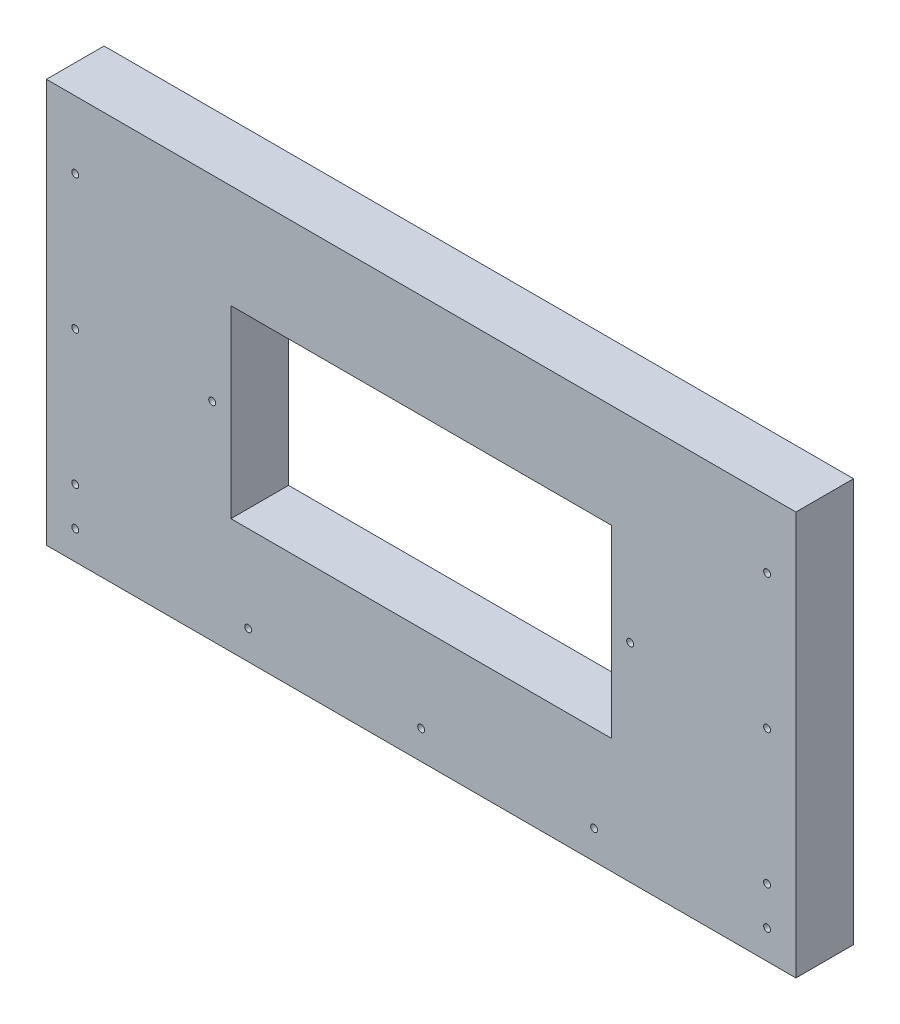
ISO-10303-21;
HEADER;
FILE_DESCRIPTION(('STEP AP214'),'2;1');
FILE_NAME('part.step','',(''),(''),'','','');
FILE_SCHEMA(('AUTOMOTIVE_DESIGN { 1 0 10303 214 1 1 1 1 }'));
ENDSEC;
DATA;
#1=APPLICATION_CONTEXT('core data for automotive mechanical design processes');
#2=APPLICATION_PROTOCOL_DEFINITION('international standard','automotive_design',2000,#1);
#3=PRODUCT_CONTEXT('',#1,'mechanical');
#4=PRODUCT('Part','Part','',(#3));
#5=PRODUCT_RELATED_PRODUCT_CATEGORY('part','',(#4));
#6=PRODUCT_DEFINITION_FORMATION('','',#4);
#7=PRODUCT_DEFINITION_CONTEXT('part definition',#1,'design');
#8=PRODUCT_DEFINITION('design','',#6,#7);
#9=PRODUCT_DEFINITION_SHAPE('','',#8);
#10=(LENGTH_UNIT() NAMED_UNIT(*) SI_UNIT(.MILLI.,.METRE.));
#11=(NAMED_UNIT(*) PLANE_ANGLE_UNIT() SI_UNIT($,.RADIAN.));
#12=(NAMED_UNIT(*) SI_UNIT($,.STERADIAN.) SOLID_ANGLE_UNIT());
#13=UNCERTAINTY_MEASURE_WITH_UNIT(LENGTH_MEASURE(1.E-05),#10,'distance_accuracy_value','');
#14=(GEOMETRIC_REPRESENTATION_CONTEXT(3) GLOBAL_UNCERTAINTY_ASSIGNED_CONTEXT((#13)) GLOBAL_UNIT_ASSIGNED_CONTEXT((#10,
#11,#12)) REPRESENTATION_CONTEXT('',''));
#15=CARTESIAN_POINT('',(0.,0.,0.));
#16=DIRECTION('',(0.,0.,1.));
#17=DIRECTION('',(1.,0.,0.));
#18=AXIS2_PLACEMENT_3D('',#15,#16,#17);
#19=CARTESIAN_POINT('',(-33.,52.,-162.));
#20=DIRECTION('',(0.,1.,0.));
#21=DIRECTION('',(-1.,0.,0.));
#22=AXIS2_PLACEMENT_3D('',#19,#20,#21);
#23=PLANE('',#22);
#24=DIRECTION('',(1.,0.,0.));
#25=VECTOR('',#24,1.);
#26=CARTESIAN_POINT('',(-33.,52.,-172.));
#27=LINE('',#26,#25);
#28=CARTESIAN_POINT('',(-33.,52.,-172.));
#29=VERTEX_POINT('',#28);
#30=CARTESIAN_POINT('',(33.,52.,-172.));
#31=VERTEX_POINT('',#30);
#32=EDGE_CURVE('E133',#29,#31,#27,.T.);
#33=ORIENTED_EDGE('',*,*,#32,.T.);
#34=DIRECTION('',(0.,0.,-1.));
#35=VECTOR('',#34,1.);
#36=CARTESIAN_POINT('',(33.,52.,-162.));
#37=LINE('',#36,#35);
#38=CARTESIAN_POINT('',(33.,52.,-162.));
#39=VERTEX_POINT('',#38);
#40=EDGE_CURVE('E160',#39,#31,#37,.T.);
#41=ORIENTED_EDGE('',*,*,#40,.F.);
#42=DIRECTION('',(1.,0.,0.));
#43=VECTOR('',#42,1.);
#44=CARTESIAN_POINT('',(-33.,52.,-162.));
#45=LINE('',#44,#43);
#46=CARTESIAN_POINT('',(-33.,52.,-162.));
#47=VERTEX_POINT('',#46);
#48=EDGE_CURVE('E118',#47,#39,#45,.T.);
#49=ORIENTED_EDGE('',*,*,#48,.F.);
#50=DIRECTION('',(0.,0.,-1.));
#51=VECTOR('',#50,1.);
#52=CARTESIAN_POINT('',(-33.,52.,-162.));
#53=LINE('',#52,#51);
#54=EDGE_CURVE('E163',#47,#29,#53,.T.);
#55=ORIENTED_EDGE('',*,*,#54,.T.);
#56=EDGE_LOOP('',(#33,#41,#49,#55));
#57=FACE_BOUND('',#56,.T.);
#58=ADVANCED_FACE('F35',(#57),#23,.F.);
#59=CARTESIAN_POINT('',(33.,20.,-162.));
#60=DIRECTION('',(1.,0.,0.));
#61=DIRECTION('',(0.,0.,-1.));
#62=AXIS2_PLACEMENT_3D('',#59,#60,#61);
#63=PLANE('',#62);
#64=DIRECTION('',(0.,-1.,0.));
#65=VECTOR('',#64,1.);
#66=CARTESIAN_POINT('',(33.,20.,-172.));
#67=LINE('',#66,#65);
#68=CARTESIAN_POINT('',(33.,20.,-172.));
#69=VERTEX_POINT('',#68);
#70=EDGE_CURVE('E113',#31,#69,#67,.T.);
#71=ORIENTED_EDGE('',*,*,#70,.T.);
#72=DIRECTION('',(0.,0.,-1.));
#73=VECTOR('',#72,1.);
#74=CARTESIAN_POINT('',(33.,20.,-162.));
#75=LINE('',#74,#73);
#76=CARTESIAN_POINT('',(33.,20.,-162.));
#77=VERTEX_POINT('',#76);
#78=EDGE_CURVE('E106',#77,#69,#75,.T.);
#79=ORIENTED_EDGE('',*,*,#78,.F.);
#80=DIRECTION('',(0.,-1.,0.));
#81=VECTOR('',#80,1.);
#82=CARTESIAN_POINT('',(33.,20.,-162.));
#83=LINE('',#82,#81);
#84=EDGE_CURVE('E110',#39,#77,#83,.T.);
#85=ORIENTED_EDGE('',*,*,#84,.F.);
#86=ORIENTED_EDGE('',*,*,#40,.T.);
#87=EDGE_LOOP('',(#71,#79,#85,#86));
#88=FACE_BOUND('',#87,.T.);
#89=ADVANCED_FACE('F108',(#88),#63,.F.);
#90=CARTESIAN_POINT('',(-33.,20.,-162.));
#91=DIRECTION('',(-1.,0.,0.));
#92=DIRECTION('',(0.,0.,1.));
#93=AXIS2_PLACEMENT_3D('',#90,#91,#92);
#94=PLANE('',#93);
#95=DIRECTION('',(0.,1.,0.));
#96=VECTOR('',#95,1.);
#97=CARTESIAN_POINT('',(-33.,20.,-172.));
#98=LINE('',#97,#96);
#99=CARTESIAN_POINT('',(-33.,20.,-172.));
#100=VERTEX_POINT('',#99);
#101=EDGE_CURVE('E137',#100,#29,#98,.T.);
#102=ORIENTED_EDGE('',*,*,#101,.T.);
#103=ORIENTED_EDGE('',*,*,#54,.F.);
#104=DIRECTION('',(0.,1.,0.));
#105=VECTOR('',#104,1.);
#106=CARTESIAN_POINT('',(-33.,20.,-162.));
#107=LINE('',#106,#105);
#108=CARTESIAN_POINT('',(-33.,20.,-162.));
#109=VERTEX_POINT('',#108);
#110=EDGE_CURVE('E127',#109,#47,#107,.T.);
#111=ORIENTED_EDGE('',*,*,#110,.F.);
#112=DIRECTION('',(0.,0.,-1.));
#113=VECTOR('',#112,1.);
#114=CARTESIAN_POINT('',(-33.,20.,-162.));
#115=LINE('',#114,#113);
#116=EDGE_CURVE('E117',#109,#100,#115,.T.);
#117=ORIENTED_EDGE('',*,*,#116,.T.);
#118=EDGE_LOOP('',(#102,#103,#111,#117));
#119=FACE_BOUND('',#118,.T.);
#120=ADVANCED_FACE('F231',(#119),#94,.F.);
#121=CARTESIAN_POINT('',(65.,10.,-172.));
#122=DIRECTION('',(0.,0.,1.));
#123=DIRECTION('',(1.,0.,0.));
#124=AXIS2_PLACEMENT_3D('',#121,#122,#123);
#125=PLANE('',#124);
#126=CARTESIAN_POINT('',(-60.0000000000001,58.3333333333333,-172.));
#127=DIRECTION('',(0.,0.,1.));
#128=DIRECTION('',(1.,0.,0.));
#129=AXIS2_PLACEMENT_3D('',#126,#127,#128);
#130=CIRCLE('',#129,0.599999999999913);
#131=CARTESIAN_POINT('',(-59.4000000000001,58.3333333333333,-172.));
#132=VERTEX_POINT('',#131);
#133=EDGE_CURVE('E359',#132,#132,#130,.T.);
#134=ORIENTED_EDGE('',*,*,#133,.T.);
#135=EDGE_LOOP('',(#134));
#136=FACE_BOUND('',#135,.T.);
#137=CARTESIAN_POINT('',(-60.,35.,-172.));
#138=DIRECTION('',(0.,0.,1.));
#139=DIRECTION('',(1.,0.,0.));
#140=AXIS2_PLACEMENT_3D('',#137,#138,#139);
#141=CIRCLE('',#140,0.599999999999913);
#142=CARTESIAN_POINT('',(-59.4000000000001,35.,-172.));
#143=VERTEX_POINT('',#142);
#144=EDGE_CURVE('E356',#143,#143,#141,.T.);
#145=ORIENTED_EDGE('',*,*,#144,.T.);
#146=EDGE_LOOP('',(#145));
#147=FACE_BOUND('',#146,.T.);
#148=CARTESIAN_POINT('',(-59.9999999999998,11.6666666666667,-172.));
#149=DIRECTION('',(0.,0.,1.));
#150=DIRECTION('',(1.,0.,0.));
#151=AXIS2_PLACEMENT_3D('',#148,#149,#150);
#152=CIRCLE('',#151,0.599999999999913);
#153=CARTESIAN_POINT('',(-59.3999999999999,11.6666666666667,-172.));
#154=VERTEX_POINT('',#153);
#155=EDGE_CURVE('E353',#154,#154,#152,.T.);
#156=ORIENTED_EDGE('',*,*,#155,.T.);
#157=EDGE_LOOP('',(#156));
#158=FACE_BOUND('',#157,.T.);
#159=CARTESIAN_POINT('',(-60.,5.,-172.));
#160=DIRECTION('',(0.,0.,1.));
#161=DIRECTION('',(1.,0.,0.));
#162=AXIS2_PLACEMENT_3D('',#159,#160,#161);
#163=CIRCLE('',#162,0.599999999999913);
#164=CARTESIAN_POINT('',(-59.4000000000001,5.,-172.));
#165=VERTEX_POINT('',#164);
#166=EDGE_CURVE('E350',#165,#165,#163,.T.);
#167=ORIENTED_EDGE('',*,*,#166,.T.);
#168=EDGE_LOOP('',(#167));
#169=FACE_BOUND('',#168,.T.);
#170=CARTESIAN_POINT('',(-30.,5.,-172.));
#171=DIRECTION('',(0.,0.,1.));
#172=DIRECTION('',(1.,0.,0.));
#173=AXIS2_PLACEMENT_3D('',#170,#171,#172);
#174=CIRCLE('',#173,0.599999999999917);
#175=CARTESIAN_POINT('',(-29.4000000000001,5.,-172.));
#176=VERTEX_POINT('',#175);
#177=EDGE_CURVE('E347',#176,#176,#174,.T.);
#178=ORIENTED_EDGE('',*,*,#177,.T.);
#179=EDGE_LOOP('',(#178));
#180=FACE_BOUND('',#179,.T.);
#181=CARTESIAN_POINT('',(0.,5.,-172.));
#182=DIRECTION('',(0.,0.,1.));
#183=DIRECTION('',(1.,0.,0.));
#184=AXIS2_PLACEMENT_3D('',#181,#182,#183);
#185=CIRCLE('',#184,0.599999999999916);
#186=CARTESIAN_POINT('',(0.599999999999916,5.,-172.));
#187=VERTEX_POINT('',#186);
#188=EDGE_CURVE('E344',#187,#187,#185,.T.);
#189=ORIENTED_EDGE('',*,*,#188,.T.);
#190=EDGE_LOOP('',(#189));
#191=FACE_BOUND('',#190,.T.);
#192=CARTESIAN_POINT('',(30.,5.,-172.));
#193=DIRECTION('',(0.,0.,1.));
#194=DIRECTION('',(1.,0.,0.));
#195=AXIS2_PLACEMENT_3D('',#192,#193,#194);
#196=CIRCLE('',#195,0.599999999999917);
#197=CARTESIAN_POINT('',(30.5999999999999,5.,-172.));
#198=VERTEX_POINT('',#197);
#199=EDGE_CURVE('E341',#198,#198,#196,.T.);
#200=ORIENTED_EDGE('',*,*,#199,.T.);
#201=EDGE_LOOP('',(#200));
#202=FACE_BOUND('',#201,.T.);
#203=CARTESIAN_POINT('',(60.,5.,-172.));
#204=DIRECTION('',(0.,0.,1.));
#205=DIRECTION('',(1.,0.,0.));
#206=AXIS2_PLACEMENT_3D('',#203,#204,#205);
#207=CIRCLE('',#206,0.599999999999913);
#208=CARTESIAN_POINT('',(60.5999999999999,5.,-172.));
#209=VERTEX_POINT('',#208);
#210=EDGE_CURVE('E338',#209,#209,#207,.T.);
#211=ORIENTED_EDGE('',*,*,#210,.T.);
#212=EDGE_LOOP('',(#211));
#213=FACE_BOUND('',#212,.T.);
#214=CARTESIAN_POINT('',(59.9999999999998,11.6666666666666,-172.));
#215=DIRECTION('',(0.,0.,1.));
#216=DIRECTION('',(1.,0.,0.));
#217=AXIS2_PLACEMENT_3D('',#214,#215,#216);
#218=CIRCLE('',#217,0.599999999999913);
#219=CARTESIAN_POINT('',(60.5999999999997,11.6666666666666,-172.));
#220=VERTEX_POINT('',#219);
#221=EDGE_CURVE('E333',#220,#220,#218,.T.);
#222=ORIENTED_EDGE('',*,*,#221,.T.);
#223=EDGE_LOOP('',(#222));
#224=FACE_BOUND('',#223,.T.);
#225=CARTESIAN_POINT('',(60.,34.9999999999999,-172.));
#226=DIRECTION('',(0.,0.,1.));
#227=DIRECTION('',(1.,0.,0.));
#228=AXIS2_PLACEMENT_3D('',#225,#226,#227);
#229=CIRCLE('',#228,0.599999999999913);
#230=CARTESIAN_POINT('',(60.5999999999999,34.9999999999999,-172.));
#231=VERTEX_POINT('',#230);
#232=EDGE_CURVE('E330',#231,#231,#229,.T.);
#233=ORIENTED_EDGE('',*,*,#232,.T.);
#234=EDGE_LOOP('',(#233));
#235=FACE_BOUND('',#234,.T.);
#236=CARTESIAN_POINT('',(60.0000000000001,58.3333333333333,-172.));
#237=DIRECTION('',(0.,0.,1.));
#238=DIRECTION('',(1.,0.,0.));
#239=AXIS2_PLACEMENT_3D('',#236,#237,#238);
#240=CIRCLE('',#239,0.599999999999913);
#241=CARTESIAN_POINT('',(60.6,58.3333333333333,-172.));
#242=VERTEX_POINT('',#241);
#243=EDGE_CURVE('E328',#242,#242,#240,.T.);
#244=ORIENTED_EDGE('',*,*,#243,.T.);
#245=EDGE_LOOP('',(#244));
#246=FACE_BOUND('',#245,.T.);
#247=DIRECTION('',(-1.,0.,0.));
#248=VECTOR('',#247,1.);
#249=CARTESIAN_POINT('',(-33.,20.,-172.));
#250=LINE('',#249,#248);
#251=EDGE_CURVE('E156',#69,#100,#250,.T.);
#252=ORIENTED_EDGE('',*,*,#251,.F.);
#253=ORIENTED_EDGE('',*,*,#70,.F.);
#254=ORIENTED_EDGE('',*,*,#32,.F.);
#255=ORIENTED_EDGE('',*,*,#101,.F.);
#256=EDGE_LOOP('',(#252,#253,#254,#255));
#257=FACE_BOUND('',#256,.T.);
#258=DIRECTION('',(-1.,0.,0.));
#259=VECTOR('',#258,1.);
#260=CARTESIAN_POINT('',(65.,0.,-172.));
#261=LINE('',#260,#259);
#262=CARTESIAN_POINT('',(65.,0.,-172.));
#263=VERTEX_POINT('',#262);
#264=CARTESIAN_POINT('',(-65.,0.,-172.));
#265=VERTEX_POINT('',#264);
#266=EDGE_CURVE('E244',#263,#265,#261,.T.);
#267=ORIENTED_EDGE('',*,*,#266,.T.);
#268=DIRECTION('',(0.,-1.,0.));
#269=VECTOR('',#268,1.);
#270=CARTESIAN_POINT('',(-65.,10.,-172.));
#271=LINE('',#270,#269);
#272=CARTESIAN_POINT('',(-65.,70.,-172.));
#273=VERTEX_POINT('',#272);
#274=EDGE_CURVE('E251',#273,#265,#271,.T.);
#275=ORIENTED_EDGE('',*,*,#274,.F.);
#276=DIRECTION('',(-1.,0.,0.));
#277=VECTOR('',#276,1.);
#278=CARTESIAN_POINT('',(65.,70.,-172.));
#279=LINE('',#278,#277);
#280=CARTESIAN_POINT('',(65.,70.,-172.));
#281=VERTEX_POINT('',#280);
#282=EDGE_CURVE('E169',#281,#273,#279,.T.);
#283=ORIENTED_EDGE('',*,*,#282,.F.);
#284=DIRECTION('',(0.,-1.,0.));
#285=VECTOR('',#284,1.);
#286=CARTESIAN_POINT('',(65.,10.,-172.));
#287=LINE('',#286,#285);
#288=EDGE_CURVE('E253',#281,#263,#287,.T.);
#289=ORIENTED_EDGE('',*,*,#288,.T.);
#290=EDGE_LOOP('',(#267,#275,#283,#289));
#291=FACE_BOUND('',#290,.T.);
#292=CARTESIAN_POINT('',(-36.25,36.,-172.));
#293=DIRECTION('',(0.,0.,-1.));
#294=DIRECTION('',(-1.,0.,0.));
#295=AXIS2_PLACEMENT_3D('',#292,#293,#294);
#296=CIRCLE('',#295,0.599999999999996);
#297=CARTESIAN_POINT('',(-36.85,36.,-172.));
#298=VERTEX_POINT('',#297);
#299=EDGE_CURVE('E197',#298,#298,#296,.T.);
#300=ORIENTED_EDGE('',*,*,#299,.F.);
#301=EDGE_LOOP('',(#300));
#302=FACE_BOUND('',#301,.T.);
#303=CARTESIAN_POINT('',(36.25,36.,-172.));
#304=DIRECTION('',(0.,0.,-1.));
#305=DIRECTION('',(-1.,0.,0.));
#306=AXIS2_PLACEMENT_3D('',#303,#304,#305);
#307=CIRCLE('',#306,0.599999999999996);
#308=CARTESIAN_POINT('',(35.65,36.,-172.));
#309=VERTEX_POINT('',#308);
#310=EDGE_CURVE('E198',#309,#309,#307,.T.);
#311=ORIENTED_EDGE('',*,*,#310,.F.);
#312=EDGE_LOOP('',(#311));
#313=FACE_BOUND('',#312,.T.);
#314=ADVANCED_FACE('F228',(#136,#147,#158,#169,#180,#191,#202,#213,#224,#235,#246,#257,#291,
#302,#313),#125,.F.);
#315=CARTESIAN_POINT('',(-60.0000000000001,58.3333333333333,172.));
#316=DIRECTION('',(0.,0.,1.));
#317=DIRECTION('',(1.,0.,0.));
#318=AXIS2_PLACEMENT_3D('',#315,#316,#317);
#319=CYLINDRICAL_SURFACE('',#318,0.599999999999951);
#320=ORIENTED_EDGE('',*,*,#133,.F.);
#321=EDGE_LOOP('',(#320));
#322=FACE_BOUND('',#321,.T.);
#323=CARTESIAN_POINT('',(-60.0000000000001,58.3333333333333,-162.));
#324=DIRECTION('',(0.,0.,1.));
#325=DIRECTION('',(1.,0.,0.));
#326=AXIS2_PLACEMENT_3D('',#323,#324,#325);
#327=CIRCLE('',#326,0.599999999999951);
#328=CARTESIAN_POINT('',(-59.4000000000001,58.3333333333333,-162.));
#329=VERTEX_POINT('',#328);
#330=EDGE_CURVE('E12',#329,#329,#327,.F.);
#331=ORIENTED_EDGE('',*,*,#330,.F.);
#332=EDGE_LOOP('',(#331));
#333=FACE_BOUND('',#332,.T.);
#334=ADVANCED_FACE('F230',(#322,#333),#319,.F.);
#335=CARTESIAN_POINT('',(-59.9999999999998,11.6666666666667,172.));
#336=DIRECTION('',(0.,0.,1.));
#337=DIRECTION('',(1.,0.,0.));
#338=AXIS2_PLACEMENT_3D('',#335,#336,#337);
#339=CYLINDRICAL_SURFACE('',#338,0.599999999999951);
#340=ORIENTED_EDGE('',*,*,#155,.F.);
#341=EDGE_LOOP('',(#340));
#342=FACE_BOUND('',#341,.T.);
#343=CARTESIAN_POINT('',(-59.9999999999998,11.6666666666667,-162.));
#344=DIRECTION('',(0.,0.,1.));
#345=DIRECTION('',(1.,0.,0.));
#346=AXIS2_PLACEMENT_3D('',#343,#344,#345);
#347=CIRCLE('',#346,0.599999999999951);
#348=CARTESIAN_POINT('',(-59.3999999999999,11.6666666666667,-162.));
#349=VERTEX_POINT('',#348);
#350=EDGE_CURVE('E45',#349,#349,#347,.F.);
#351=ORIENTED_EDGE('',*,*,#350,.F.);
#352=EDGE_LOOP('',(#351));
#353=FACE_BOUND('',#352,.T.);
#354=ADVANCED_FACE('F366',(#342,#353),#339,.F.);
#355=CARTESIAN_POINT('',(-60.,5.,172.));
#356=DIRECTION('',(0.,0.,1.));
#357=DIRECTION('',(1.,0.,0.));
#358=AXIS2_PLACEMENT_3D('',#355,#356,#357);
#359=CYLINDRICAL_SURFACE('',#358,0.599999999999951);
#360=ORIENTED_EDGE('',*,*,#166,.F.);
#361=EDGE_LOOP('',(#360));
#362=FACE_BOUND('',#361,.T.);
#363=CARTESIAN_POINT('',(-60.,5.,-162.));
#364=DIRECTION('',(0.,0.,1.));
#365=DIRECTION('',(1.,0.,0.));
#366=AXIS2_PLACEMENT_3D('',#363,#364,#365);
#367=CIRCLE('',#366,0.599999999999951);
#368=CARTESIAN_POINT('',(-59.4,5.,-162.));
#369=VERTEX_POINT('',#368);
#370=EDGE_CURVE('E258',#369,#369,#367,.F.);
#371=ORIENTED_EDGE('',*,*,#370,.F.);
#372=EDGE_LOOP('',(#371));
#373=FACE_BOUND('',#372,.T.);
#374=ADVANCED_FACE('F400',(#362,#373),#359,.F.);
#375=CARTESIAN_POINT('',(-30.,5.,172.));
#376=DIRECTION('',(0.,0.,1.));
#377=DIRECTION('',(1.,0.,0.));
#378=AXIS2_PLACEMENT_3D('',#375,#376,#377);
#379=CYLINDRICAL_SURFACE('',#378,0.599999999999953);
#380=ORIENTED_EDGE('',*,*,#177,.F.);
#381=EDGE_LOOP('',(#380));
#382=FACE_BOUND('',#381,.T.);
#383=CARTESIAN_POINT('',(-30.,5.,-162.));
#384=DIRECTION('',(0.,0.,1.));
#385=DIRECTION('',(1.,0.,0.));
#386=AXIS2_PLACEMENT_3D('',#383,#384,#385);
#387=CIRCLE('',#386,0.599999999999953);
#388=CARTESIAN_POINT('',(-29.4,5.,-162.));
#389=VERTEX_POINT('',#388);
#390=EDGE_CURVE('E262',#389,#389,#387,.F.);
#391=ORIENTED_EDGE('',*,*,#390,.F.);
#392=EDGE_LOOP('',(#391));
#393=FACE_BOUND('',#392,.T.);
#394=ADVANCED_FACE('F396',(#382,#393),#379,.F.);
#395=CARTESIAN_POINT('',(0.,5.,172.));
#396=DIRECTION('',(0.,0.,1.));
#397=DIRECTION('',(1.,0.,0.));
#398=AXIS2_PLACEMENT_3D('',#395,#396,#397);
#399=CYLINDRICAL_SURFACE('',#398,0.599999999999952);
#400=ORIENTED_EDGE('',*,*,#188,.F.);
#401=EDGE_LOOP('',(#400));
#402=FACE_BOUND('',#401,.T.);
#403=CARTESIAN_POINT('',(0.,5.,-162.));
#404=DIRECTION('',(0.,0.,1.));
#405=DIRECTION('',(1.,0.,0.));
#406=AXIS2_PLACEMENT_3D('',#403,#404,#405);
#407=CIRCLE('',#406,0.599999999999952);
#408=CARTESIAN_POINT('',(0.599999999999952,5.,-162.));
#409=VERTEX_POINT('',#408);
#410=EDGE_CURVE('E266',#409,#409,#407,.F.);
#411=ORIENTED_EDGE('',*,*,#410,.F.);
#412=EDGE_LOOP('',(#411));
#413=FACE_BOUND('',#412,.T.);
#414=ADVANCED_FACE('F392',(#402,#413),#399,.F.);
#415=CARTESIAN_POINT('',(30.,5.,172.));
#416=DIRECTION('',(0.,0.,1.));
#417=DIRECTION('',(1.,0.,0.));
#418=AXIS2_PLACEMENT_3D('',#415,#416,#417);
#419=CYLINDRICAL_SURFACE('',#418,0.599999999999953);
#420=ORIENTED_EDGE('',*,*,#199,.F.);
#421=EDGE_LOOP('',(#420));
#422=FACE_BOUND('',#421,.T.);
#423=CARTESIAN_POINT('',(30.,5.,-162.));
#424=DIRECTION('',(0.,0.,1.));
#425=DIRECTION('',(1.,0.,0.));
#426=AXIS2_PLACEMENT_3D('',#423,#424,#425);
#427=CIRCLE('',#426,0.599999999999953);
#428=CARTESIAN_POINT('',(30.6,5.,-162.));
#429=VERTEX_POINT('',#428);
#430=EDGE_CURVE('E270',#429,#429,#427,.F.);
#431=ORIENTED_EDGE('',*,*,#430,.F.);
#432=EDGE_LOOP('',(#431));
#433=FACE_BOUND('',#432,.T.);
#434=ADVANCED_FACE('F385',(#422,#433),#419,.F.);
#435=CARTESIAN_POINT('',(60.,5.,172.));
#436=DIRECTION('',(0.,0.,1.));
#437=DIRECTION('',(1.,0.,0.));
#438=AXIS2_PLACEMENT_3D('',#435,#436,#437);
#439=CYLINDRICAL_SURFACE('',#438,0.599999999999951);
#440=ORIENTED_EDGE('',*,*,#210,.F.);
#441=EDGE_LOOP('',(#440));
#442=FACE_BOUND('',#441,.T.);
#443=CARTESIAN_POINT('',(60.,5.,-162.));
#444=DIRECTION('',(0.,0.,1.));
#445=DIRECTION('',(1.,0.,0.));
#446=AXIS2_PLACEMENT_3D('',#443,#444,#445);
#447=CIRCLE('',#446,0.599999999999951);
#448=CARTESIAN_POINT('',(60.5999999999999,5.,-162.));
#449=VERTEX_POINT('',#448);
#450=EDGE_CURVE('E274',#449,#449,#447,.F.);
#451=ORIENTED_EDGE('',*,*,#450,.F.);
#452=EDGE_LOOP('',(#451));
#453=FACE_BOUND('',#452,.T.);
#454=ADVANCED_FACE('F380',(#442,#453),#439,.F.);
#455=CARTESIAN_POINT('',(59.9999999999998,11.6666666666666,172.));
#456=DIRECTION('',(0.,0.,1.));
#457=DIRECTION('',(1.,0.,0.));
#458=AXIS2_PLACEMENT_3D('',#455,#456,#457);
#459=CYLINDRICAL_SURFACE('',#458,0.599999999999951);
#460=ORIENTED_EDGE('',*,*,#221,.F.);
#461=EDGE_LOOP('',(#460));
#462=FACE_BOUND('',#461,.T.);
#463=CARTESIAN_POINT('',(59.9999999999998,11.6666666666666,-162.));
#464=DIRECTION('',(0.,0.,1.));
#465=DIRECTION('',(1.,0.,0.));
#466=AXIS2_PLACEMENT_3D('',#463,#464,#465);
#467=CIRCLE('',#466,0.599999999999951);
#468=CARTESIAN_POINT('',(60.5999999999998,11.6666666666666,-162.));
#469=VERTEX_POINT('',#468);
#470=EDGE_CURVE('E278',#469,#469,#467,.F.);
#471=ORIENTED_EDGE('',*,*,#470,.F.);
#472=EDGE_LOOP('',(#471));
#473=FACE_BOUND('',#472,.T.);
#474=ADVANCED_FACE('F304',(#462,#473),#459,.F.);
#475=CARTESIAN_POINT('',(60.,34.9999999999999,172.));
#476=DIRECTION('',(0.,0.,1.));
#477=DIRECTION('',(1.,0.,0.));
#478=AXIS2_PLACEMENT_3D('',#475,#476,#477);
#479=CYLINDRICAL_SURFACE('',#478,0.599999999999951);
#480=ORIENTED_EDGE('',*,*,#232,.F.);
#481=EDGE_LOOP('',(#480));
#482=FACE_BOUND('',#481,.T.);
#483=CARTESIAN_POINT('',(60.,34.9999999999999,-162.));
#484=DIRECTION('',(0.,0.,1.));
#485=DIRECTION('',(1.,0.,0.));
#486=AXIS2_PLACEMENT_3D('',#483,#484,#485);
#487=CIRCLE('',#486,0.599999999999951);
#488=CARTESIAN_POINT('',(60.5999999999999,34.9999999999999,-162.));
#489=VERTEX_POINT('',#488);
#490=EDGE_CURVE('E281',#489,#489,#487,.F.);
#491=ORIENTED_EDGE('',*,*,#490,.F.);
#492=EDGE_LOOP('',(#491));
#493=FACE_BOUND('',#492,.T.);
#494=ADVANCED_FACE('F295',(#482,#493),#479,.F.);
#495=CARTESIAN_POINT('',(60.0000000000001,58.3333333333333,172.));
#496=DIRECTION('',(0.,0.,1.));
#497=DIRECTION('',(1.,0.,0.));
#498=AXIS2_PLACEMENT_3D('',#495,#496,#497);
#499=CYLINDRICAL_SURFACE('',#498,0.599999999999951);
#500=ORIENTED_EDGE('',*,*,#243,.F.);
#501=EDGE_LOOP('',(#500));
#502=FACE_BOUND('',#501,.T.);
#503=CARTESIAN_POINT('',(60.0000000000001,58.3333333333333,-162.));
#504=DIRECTION('',(0.,0.,1.));
#505=DIRECTION('',(1.,0.,0.));
#506=AXIS2_PLACEMENT_3D('',#503,#504,#505);
#507=CIRCLE('',#506,0.599999999999951);
#508=CARTESIAN_POINT('',(60.6,58.3333333333333,-162.));
#509=VERTEX_POINT('',#508);
#510=EDGE_CURVE('E185',#509,#509,#507,.F.);
#511=ORIENTED_EDGE('',*,*,#510,.F.);
#512=EDGE_LOOP('',(#511));
#513=FACE_BOUND('',#512,.T.);
#514=ADVANCED_FACE('F292',(#502,#513),#499,.F.);
#515=CARTESIAN_POINT('',(36.25,36.,-172.));
#516=DIRECTION('',(0.,0.,-1.));
#517=DIRECTION('',(-1.,0.,0.));
#518=AXIS2_PLACEMENT_3D('',#515,#516,#517);
#519=CYLINDRICAL_SURFACE('',#518,0.599999999999996);
#520=ORIENTED_EDGE('',*,*,#310,.T.);
#521=EDGE_LOOP('',(#520));
#522=FACE_BOUND('',#521,.T.);
#523=CARTESIAN_POINT('',(36.25,36.,-162.));
#524=DIRECTION('',(0.,0.,1.));
#525=DIRECTION('',(1.,0.,0.));
#526=AXIS2_PLACEMENT_3D('',#523,#524,#525);
#527=CIRCLE('',#526,0.599999999999996);
#528=CARTESIAN_POINT('',(36.85,36.,-162.));
#529=VERTEX_POINT('',#528);
#530=EDGE_CURVE('E192',#529,#529,#527,.T.);
#531=ORIENTED_EDGE('',*,*,#530,.T.);
#532=EDGE_LOOP('',(#531));
#533=FACE_BOUND('',#532,.T.);
#534=ADVANCED_FACE('F294',(#522,#533),#519,.F.);
#535=CARTESIAN_POINT('',(-36.25,36.,-172.));
#536=DIRECTION('',(0.,0.,-1.));
#537=DIRECTION('',(-1.,0.,0.));
#538=AXIS2_PLACEMENT_3D('',#535,#536,#537);
#539=CYLINDRICAL_SURFACE('',#538,0.599999999999996);
#540=ORIENTED_EDGE('',*,*,#299,.T.);
#541=EDGE_LOOP('',(#540));
#542=FACE_BOUND('',#541,.T.);
#543=CARTESIAN_POINT('',(-36.25,36.,-162.));
#544=DIRECTION('',(0.,0.,1.));
#545=DIRECTION('',(1.,0.,0.));
#546=AXIS2_PLACEMENT_3D('',#543,#544,#545);
#547=CIRCLE('',#546,0.599999999999996);
#548=CARTESIAN_POINT('',(-35.65,36.,-162.));
#549=VERTEX_POINT('',#548);
#550=EDGE_CURVE('E141',#549,#549,#547,.T.);
#551=ORIENTED_EDGE('',*,*,#550,.T.);
#552=EDGE_LOOP('',(#551));
#553=FACE_BOUND('',#552,.T.);
#554=ADVANCED_FACE('F206',(#542,#553),#539,.F.);
#555=CARTESIAN_POINT('',(-33.,20.,-162.));
#556=DIRECTION('',(0.,-1.,0.));
#557=DIRECTION('',(1.,0.,0.));
#558=AXIS2_PLACEMENT_3D('',#555,#556,#557);
#559=PLANE('',#558);
#560=ORIENTED_EDGE('',*,*,#251,.T.);
#561=ORIENTED_EDGE('',*,*,#116,.F.);
#562=DIRECTION('',(-1.,0.,0.));
#563=VECTOR('',#562,1.);
#564=CARTESIAN_POINT('',(-33.,20.,-162.));
#565=LINE('',#564,#563);
#566=EDGE_CURVE('E122',#77,#109,#565,.T.);
#567=ORIENTED_EDGE('',*,*,#566,.F.);
#568=ORIENTED_EDGE('',*,*,#78,.T.);
#569=EDGE_LOOP('',(#560,#561,#567,#568));
#570=FACE_BOUND('',#569,.T.);
#571=ADVANCED_FACE('F123',(#570),#559,.F.);
#572=CARTESIAN_POINT('',(65.,10.,172.));
#573=DIRECTION('',(-1.,0.,0.));
#574=DIRECTION('',(0.,0.,1.));
#575=AXIS2_PLACEMENT_3D('',#572,#573,#574);
#576=PLANE('',#575);
#577=DIRECTION('',(0.,1.,0.));
#578=VECTOR('',#577,1.);
#579=CARTESIAN_POINT('',(65.,10.,-162.));
#580=LINE('',#579,#578);
#581=CARTESIAN_POINT('',(65.,0.,-162.));
#582=VERTEX_POINT('',#581);
#583=CARTESIAN_POINT('',(65.,70.,-162.));
#584=VERTEX_POINT('',#583);
#585=EDGE_CURVE('E180',#582,#584,#580,.T.);
#586=ORIENTED_EDGE('',*,*,#585,.F.);
#587=DIRECTION('',(0.,0.,-1.));
#588=VECTOR('',#587,1.);
#589=CARTESIAN_POINT('',(65.,0.,172.));
#590=LINE('',#589,#588);
#591=EDGE_CURVE('E61',#582,#263,#590,.T.);
#592=ORIENTED_EDGE('',*,*,#591,.T.);
#593=ORIENTED_EDGE('',*,*,#288,.F.);
#594=DIRECTION('',(0.,0.,-1.));
#595=VECTOR('',#594,1.);
#596=CARTESIAN_POINT('',(65.,70.,172.));
#597=LINE('',#596,#595);
#598=EDGE_CURVE('E243',#584,#281,#597,.T.);
#599=ORIENTED_EDGE('',*,*,#598,.F.);
#600=EDGE_LOOP('',(#586,#592,#593,#599));
#601=FACE_BOUND('',#600,.T.);
#602=ADVANCED_FACE('F233',(#601),#576,.F.);
#603=CARTESIAN_POINT('',(-65.,10.,172.));
#604=DIRECTION('',(1.,0.,0.));
#605=DIRECTION('',(0.,0.,-1.));
#606=AXIS2_PLACEMENT_3D('',#603,#604,#605);
#607=PLANE('',#606);
#608=DIRECTION('',(0.,-1.,0.));
#609=VECTOR('',#608,1.);
#610=CARTESIAN_POINT('',(-65.,10.,-162.));
#611=LINE('',#610,#609);
#612=CARTESIAN_POINT('',(-65.,70.,-162.));
#613=VERTEX_POINT('',#612);
#614=CARTESIAN_POINT('',(-65.,0.,-162.));
#615=VERTEX_POINT('',#614);
#616=EDGE_CURVE('E176',#613,#615,#611,.T.);
#617=ORIENTED_EDGE('',*,*,#616,.F.);
#618=DIRECTION('',(0.,0.,1.));
#619=VECTOR('',#618,1.);
#620=CARTESIAN_POINT('',(-65.,70.,-172.));
#621=LINE('',#620,#619);
#622=EDGE_CURVE('E247',#273,#613,#621,.T.);
#623=ORIENTED_EDGE('',*,*,#622,.F.);
#624=ORIENTED_EDGE('',*,*,#274,.T.);
#625=DIRECTION('',(0.,0.,1.));
#626=VECTOR('',#625,1.);
#627=CARTESIAN_POINT('',(-65.,0.,172.));
#628=LINE('',#627,#626);
#629=EDGE_CURVE('E53',#265,#615,#628,.T.);
#630=ORIENTED_EDGE('',*,*,#629,.T.);
#631=EDGE_LOOP('',(#617,#623,#624,#630));
#632=FACE_BOUND('',#631,.T.);
#633=ADVANCED_FACE('F37',(#632),#607,.F.);
#634=CARTESIAN_POINT('',(0.,70.,0.));
#635=DIRECTION('',(0.,1.,0.));
#636=DIRECTION('',(0.,0.,1.));
#637=AXIS2_PLACEMENT_3D('',#634,#635,#636);
#638=PLANE('',#637);
#639=ORIENTED_EDGE('',*,*,#622,.T.);
#640=DIRECTION('',(-1.,0.,0.));
#641=VECTOR('',#640,1.);
#642=CARTESIAN_POINT('',(55.,70.,-162.));
#643=LINE('',#642,#641);
#644=EDGE_CURVE('E162',#584,#613,#643,.T.);
#645=ORIENTED_EDGE('',*,*,#644,.F.);
#646=ORIENTED_EDGE('',*,*,#598,.T.);
#647=ORIENTED_EDGE('',*,*,#282,.T.);
#648=EDGE_LOOP('',(#639,#645,#646,#647));
#649=FACE_BOUND('',#648,.T.);
#650=ADVANCED_FACE('F222',(#649),#638,.T.);
#651=CARTESIAN_POINT('',(0.,0.,0.));
#652=DIRECTION('',(0.,1.,0.));
#653=DIRECTION('',(0.,0.,1.));
#654=AXIS2_PLACEMENT_3D('',#651,#652,#653);
#655=PLANE('',#654);
#656=DIRECTION('',(1.,0.,0.));
#657=VECTOR('',#656,1.);
#658=CARTESIAN_POINT('',(0.,0.,-162.));
#659=LINE('',#658,#657);
#660=EDGE_CURVE('E179',#615,#582,#659,.T.);
#661=ORIENTED_EDGE('',*,*,#660,.F.);
#662=ORIENTED_EDGE('',*,*,#629,.F.);
#663=ORIENTED_EDGE('',*,*,#266,.F.);
#664=ORIENTED_EDGE('',*,*,#591,.F.);
#665=EDGE_LOOP('',(#661,#662,#663,#664));
#666=FACE_BOUND('',#665,.T.);
#667=ADVANCED_FACE('F215',(#666),#655,.F.);
#668=CARTESIAN_POINT('',(-60.,35.,172.));
#669=DIRECTION('',(0.,0.,1.));
#670=DIRECTION('',(1.,0.,0.));
#671=AXIS2_PLACEMENT_3D('',#668,#669,#670);
#672=CYLINDRICAL_SURFACE('',#671,0.599999999999951);
#673=ORIENTED_EDGE('',*,*,#144,.F.);
#674=EDGE_LOOP('',(#673));
#675=FACE_BOUND('',#674,.T.);
#676=CARTESIAN_POINT('',(-60.,35.,-162.));
#677=DIRECTION('',(0.,0.,1.));
#678=DIRECTION('',(1.,0.,0.));
#679=AXIS2_PLACEMENT_3D('',#676,#677,#678);
#680=CIRCLE('',#679,0.599999999999951);
#681=CARTESIAN_POINT('',(-59.4,35.,-162.));
#682=VERTEX_POINT('',#681);
#683=EDGE_CURVE('E39',#682,#682,#680,.F.);
#684=ORIENTED_EDGE('',*,*,#683,.F.);
#685=EDGE_LOOP('',(#684));
#686=FACE_BOUND('',#685,.T.);
#687=ADVANCED_FACE('F209',(#675,#686),#672,.F.);
#688=CARTESIAN_POINT('',(55.,70.,-162.));
#689=DIRECTION('',(0.,0.,1.));
#690=DIRECTION('',(1.,0.,0.));
#691=AXIS2_PLACEMENT_3D('',#688,#689,#690);
#692=PLANE('',#691);
#693=ORIENTED_EDGE('',*,*,#644,.T.);
#694=ORIENTED_EDGE('',*,*,#616,.T.);
#695=ORIENTED_EDGE('',*,*,#660,.T.);
#696=ORIENTED_EDGE('',*,*,#585,.T.);
#697=EDGE_LOOP('',(#693,#694,#695,#696));
#698=FACE_BOUND('',#697,.T.);
#699=ORIENTED_EDGE('',*,*,#530,.F.);
#700=EDGE_LOOP('',(#699));
#701=FACE_BOUND('',#700,.T.);
#702=ORIENTED_EDGE('',*,*,#550,.F.);
#703=EDGE_LOOP('',(#702));
#704=FACE_BOUND('',#703,.T.);
#705=ORIENTED_EDGE('',*,*,#84,.T.);
#706=ORIENTED_EDGE('',*,*,#566,.T.);
#707=ORIENTED_EDGE('',*,*,#110,.T.);
#708=ORIENTED_EDGE('',*,*,#48,.T.);
#709=EDGE_LOOP('',(#705,#706,#707,#708));
#710=FACE_BOUND('',#709,.T.);
#711=ORIENTED_EDGE('',*,*,#683,.T.);
#712=EDGE_LOOP('',(#711));
#713=FACE_BOUND('',#712,.T.);
#714=ORIENTED_EDGE('',*,*,#490,.T.);
#715=EDGE_LOOP('',(#714));
#716=FACE_BOUND('',#715,.T.);
#717=ORIENTED_EDGE('',*,*,#450,.T.);
#718=EDGE_LOOP('',(#717));
#719=FACE_BOUND('',#718,.T.);
#720=ORIENTED_EDGE('',*,*,#410,.T.);
#721=EDGE_LOOP('',(#720));
#722=FACE_BOUND('',#721,.T.);
#723=ORIENTED_EDGE('',*,*,#370,.T.);
#724=EDGE_LOOP('',(#723));
#725=FACE_BOUND('',#724,.T.);
#726=ORIENTED_EDGE('',*,*,#330,.T.);
#727=EDGE_LOOP('',(#726));
#728=FACE_BOUND('',#727,.T.);
#729=ORIENTED_EDGE('',*,*,#350,.T.);
#730=EDGE_LOOP('',(#729));
#731=FACE_BOUND('',#730,.T.);
#732=ORIENTED_EDGE('',*,*,#390,.T.);
#733=EDGE_LOOP('',(#732));
#734=FACE_BOUND('',#733,.T.);
#735=ORIENTED_EDGE('',*,*,#430,.T.);
#736=EDGE_LOOP('',(#735));
#737=FACE_BOUND('',#736,.T.);
#738=ORIENTED_EDGE('',*,*,#470,.T.);
#739=EDGE_LOOP('',(#738));
#740=FACE_BOUND('',#739,.T.);
#741=ORIENTED_EDGE('',*,*,#510,.T.);
#742=EDGE_LOOP('',(#741));
#743=FACE_BOUND('',#742,.T.);
#744=ADVANCED_FACE('F129',(#698,#701,#704,#710,#713,#716,#719,#722,#725,#728,#731,#734,#737,
#740,#743),#692,.T.);
#745=CLOSED_SHELL('',(#58,#89,#120,#314,#334,#354,#374,#394,#414,#434,#454,#474,#494,#514,#534,
#554,#571,#602,#633,#650,#667,#687,#744));
#746=MANIFOLD_SOLID_BREP('B2',#745);
#747=ADVANCED_BREP_SHAPE_REPRESENTATION('',(#18,#746),#14);
#748=SHAPE_DEFINITION_REPRESENTATION(#9,#747);
ENDSEC;
END-ISO-10303-21;
